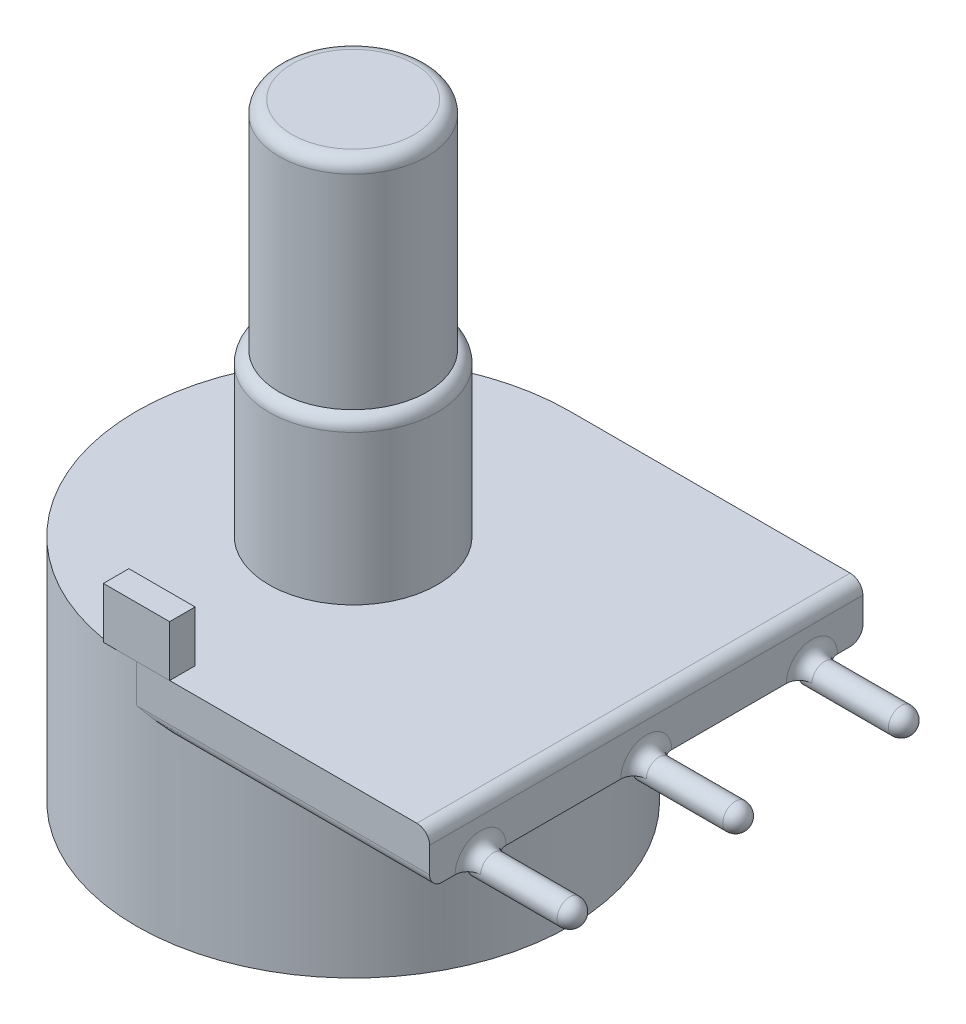
ISO-10303-21;
HEADER;
FILE_DESCRIPTION(('STEP AP214'),'2;1');
FILE_NAME('part.step','',(''),(''),'','','');
FILE_SCHEMA(('AUTOMOTIVE_DESIGN { 1 0 10303 214 1 1 1 1 }'));
ENDSEC;
DATA;
#1=APPLICATION_CONTEXT('core data for automotive mechanical design processes');
#2=APPLICATION_PROTOCOL_DEFINITION('international standard','automotive_design',2000,#1);
#3=PRODUCT_CONTEXT('',#1,'mechanical');
#4=PRODUCT('Part','Part','',(#3));
#5=PRODUCT_RELATED_PRODUCT_CATEGORY('part','',(#4));
#6=PRODUCT_DEFINITION_FORMATION('','',#4);
#7=PRODUCT_DEFINITION_CONTEXT('part definition',#1,'design');
#8=PRODUCT_DEFINITION('design','',#6,#7);
#9=PRODUCT_DEFINITION_SHAPE('','',#8);
#10=(LENGTH_UNIT() NAMED_UNIT(*) SI_UNIT(.MILLI.,.METRE.));
#11=(NAMED_UNIT(*) PLANE_ANGLE_UNIT() SI_UNIT($,.RADIAN.));
#12=(NAMED_UNIT(*) SI_UNIT($,.STERADIAN.) SOLID_ANGLE_UNIT());
#13=UNCERTAINTY_MEASURE_WITH_UNIT(LENGTH_MEASURE(1.E-05),#10,'distance_accuracy_value','');
#14=(GEOMETRIC_REPRESENTATION_CONTEXT(3) GLOBAL_UNCERTAINTY_ASSIGNED_CONTEXT((#13)) GLOBAL_UNIT_ASSIGNED_CONTEXT((#10,
#11,#12)) REPRESENTATION_CONTEXT('',''));
#15=CARTESIAN_POINT('',(0.,0.,0.));
#16=DIRECTION('',(0.,0.,1.));
#17=DIRECTION('',(1.,0.,0.));
#18=AXIS2_PLACEMENT_3D('',#15,#16,#17);
#19=CARTESIAN_POINT('',(-1.3,11.,7.5));
#20=DIRECTION('',(1.,0.,0.));
#21=DIRECTION('',(0.,0.,-1.));
#22=AXIS2_PLACEMENT_3D('',#19,#20,#21);
#23=PLANE('',#22);
#24=DIRECTION('',(0.,0.,1.));
#25=VECTOR('',#24,1.);
#26=CARTESIAN_POINT('',(-1.3,9.,7.5));
#27=LINE('',#26,#25);
#28=CARTESIAN_POINT('',(-1.3,9.,7.5));
#29=VERTEX_POINT('',#28);
#30=CARTESIAN_POINT('',(-1.3,9.,8.5));
#31=VERTEX_POINT('',#30);
#32=EDGE_CURVE('E108',#29,#31,#27,.T.);
#33=ORIENTED_EDGE('',*,*,#32,.T.);
#34=DIRECTION('',(0.,-1.,0.));
#35=VECTOR('',#34,1.);
#36=CARTESIAN_POINT('',(-1.3,11.,8.5));
#37=LINE('',#36,#35);
#38=CARTESIAN_POINT('',(-1.3,11.,8.5));
#39=VERTEX_POINT('',#38);
#40=EDGE_CURVE('E12',#39,#31,#37,.T.);
#41=ORIENTED_EDGE('',*,*,#40,.F.);
#42=DIRECTION('',(0.,0.,1.));
#43=VECTOR('',#42,1.);
#44=CARTESIAN_POINT('',(-1.3,11.,7.5));
#45=LINE('',#44,#43);
#46=CARTESIAN_POINT('',(-1.3,11.,7.5));
#47=VERTEX_POINT('',#46);
#48=EDGE_CURVE('E96',#47,#39,#45,.T.);
#49=ORIENTED_EDGE('',*,*,#48,.F.);
#50=DIRECTION('',(0.,-1.,0.));
#51=VECTOR('',#50,1.);
#52=CARTESIAN_POINT('',(-1.3,11.,7.5));
#53=LINE('',#52,#51);
#54=EDGE_CURVE('E104',#47,#29,#53,.T.);
#55=ORIENTED_EDGE('',*,*,#54,.T.);
#56=EDGE_LOOP('',(#33,#41,#49,#55));
#57=FACE_BOUND('',#56,.T.);
#58=ADVANCED_FACE('F45',(#57),#23,.F.);
#59=CARTESIAN_POINT('',(-1.3,11.,8.5));
#60=DIRECTION('',(0.,0.,-1.));
#61=DIRECTION('',(-1.,0.,0.));
#62=AXIS2_PLACEMENT_3D('',#59,#60,#61);
#63=PLANE('',#62);
#64=DIRECTION('',(1.,0.,0.));
#65=VECTOR('',#64,1.);
#66=CARTESIAN_POINT('',(-1.3,9.,8.5));
#67=LINE('',#66,#65);
#68=CARTESIAN_POINT('',(1.3,9.,8.5));
#69=VERTEX_POINT('',#68);
#70=EDGE_CURVE('E100',#31,#69,#67,.T.);
#71=ORIENTED_EDGE('',*,*,#70,.T.);
#72=DIRECTION('',(0.,-1.,0.));
#73=VECTOR('',#72,1.);
#74=CARTESIAN_POINT('',(1.3,11.,8.5));
#75=LINE('',#74,#73);
#76=CARTESIAN_POINT('',(1.3,11.,8.5));
#77=VERTEX_POINT('',#76);
#78=EDGE_CURVE('E53',#77,#69,#75,.T.);
#79=ORIENTED_EDGE('',*,*,#78,.F.);
#80=DIRECTION('',(1.,0.,0.));
#81=VECTOR('',#80,1.);
#82=CARTESIAN_POINT('',(-1.3,11.,8.5));
#83=LINE('',#82,#81);
#84=EDGE_CURVE('E91',#39,#77,#83,.T.);
#85=ORIENTED_EDGE('',*,*,#84,.F.);
#86=ORIENTED_EDGE('',*,*,#40,.T.);
#87=EDGE_LOOP('',(#71,#79,#85,#86));
#88=FACE_BOUND('',#87,.T.);
#89=ADVANCED_FACE('F99',(#88),#63,.F.);
#90=CARTESIAN_POINT('',(1.3,11.,7.5));
#91=DIRECTION('',(-1.,0.,0.));
#92=DIRECTION('',(0.,0.,1.));
#93=AXIS2_PLACEMENT_3D('',#90,#91,#92);
#94=PLANE('',#93);
#95=DIRECTION('',(0.,0.,-1.));
#96=VECTOR('',#95,1.);
#97=CARTESIAN_POINT('',(1.3,9.,7.5));
#98=LINE('',#97,#96);
#99=CARTESIAN_POINT('',(1.3,9.,7.5));
#100=VERTEX_POINT('',#99);
#101=EDGE_CURVE('E78',#69,#100,#98,.T.);
#102=ORIENTED_EDGE('',*,*,#101,.T.);
#103=DIRECTION('',(0.,-1.,0.));
#104=VECTOR('',#103,1.);
#105=CARTESIAN_POINT('',(1.3,11.,7.5));
#106=LINE('',#105,#104);
#107=CARTESIAN_POINT('',(1.3,11.,7.5));
#108=VERTEX_POINT('',#107);
#109=EDGE_CURVE('E101',#108,#100,#106,.T.);
#110=ORIENTED_EDGE('',*,*,#109,.F.);
#111=DIRECTION('',(0.,0.,-1.));
#112=VECTOR('',#111,1.);
#113=CARTESIAN_POINT('',(1.3,11.,7.5));
#114=LINE('',#113,#112);
#115=EDGE_CURVE('E94',#77,#108,#114,.T.);
#116=ORIENTED_EDGE('',*,*,#115,.F.);
#117=ORIENTED_EDGE('',*,*,#78,.T.);
#118=EDGE_LOOP('',(#102,#110,#116,#117));
#119=FACE_BOUND('',#118,.T.);
#120=ADVANCED_FACE('F102',(#119),#94,.F.);
#121=CARTESIAN_POINT('',(-1.3,11.,7.5));
#122=DIRECTION('',(0.,0.,1.));
#123=DIRECTION('',(1.,0.,0.));
#124=AXIS2_PLACEMENT_3D('',#121,#122,#123);
#125=PLANE('',#124);
#126=DIRECTION('',(-1.,0.,0.));
#127=VECTOR('',#126,1.);
#128=CARTESIAN_POINT('',(-1.3,9.,7.5));
#129=LINE('',#128,#127);
#130=EDGE_CURVE('E84',#100,#29,#129,.T.);
#131=ORIENTED_EDGE('',*,*,#130,.T.);
#132=ORIENTED_EDGE('',*,*,#54,.F.);
#133=DIRECTION('',(-1.,0.,0.));
#134=VECTOR('',#133,1.);
#135=CARTESIAN_POINT('',(-1.3,11.,7.5));
#136=LINE('',#135,#134);
#137=EDGE_CURVE('E61',#108,#47,#136,.T.);
#138=ORIENTED_EDGE('',*,*,#137,.F.);
#139=ORIENTED_EDGE('',*,*,#109,.T.);
#140=EDGE_LOOP('',(#131,#132,#138,#139));
#141=FACE_BOUND('',#140,.T.);
#142=ADVANCED_FACE('F115',(#141),#125,.F.);
#143=CARTESIAN_POINT('',(0.,11.,0.));
#144=DIRECTION('',(0.,1.,0.));
#145=DIRECTION('',(0.,0.,1.));
#146=AXIS2_PLACEMENT_3D('',#143,#144,#145);
#147=PLANE('',#146);
#148=ORIENTED_EDGE('',*,*,#48,.T.);
#149=ORIENTED_EDGE('',*,*,#84,.T.);
#150=ORIENTED_EDGE('',*,*,#115,.T.);
#151=ORIENTED_EDGE('',*,*,#137,.T.);
#152=EDGE_LOOP('',(#148,#149,#150,#151));
#153=FACE_BOUND('',#152,.T.);
#154=ADVANCED_FACE('F92',(#153),#147,.T.);
#155=CARTESIAN_POINT('',(0.,9.,0.));
#156=DIRECTION('',(0.,1.,0.));
#157=DIRECTION('',(0.,0.,1.));
#158=AXIS2_PLACEMENT_3D('',#155,#156,#157);
#159=PLANE('',#158);
#160=ORIENTED_EDGE('',*,*,#32,.F.);
#161=ORIENTED_EDGE('',*,*,#130,.F.);
#162=ORIENTED_EDGE('',*,*,#101,.F.);
#163=ORIENTED_EDGE('',*,*,#70,.F.);
#164=EDGE_LOOP('',(#160,#161,#162,#163));
#165=FACE_BOUND('',#164,.T.);
#166=ADVANCED_FACE('F118',(#165),#159,.F.);
#167=CLOSED_SHELL('',(#58,#89,#120,#142,#154,#166));
#168=MANIFOLD_SOLID_BREP('B2',#167);
#169=CARTESIAN_POINT('',(11.5,7.,-8.5));
#170=DIRECTION('',(1.,0.,0.));
#171=DIRECTION('',(0.,0.,-1.));
#172=AXIS2_PLACEMENT_3D('',#169,#170,#171);
#173=PLANE('',#172);
#174=DIRECTION('',(0.,0.,-1.));
#175=VECTOR('',#174,1.);
#176=CARTESIAN_POINT('',(11.5,7.,-8.5));
#177=LINE('',#176,#175);
#178=CARTESIAN_POINT('',(11.5,7.,8.));
#179=VERTEX_POINT('',#178);
#180=CARTESIAN_POINT('',(11.5,7.,7.5));
#181=VERTEX_POINT('',#180);
#182=EDGE_CURVE('E318',#179,#181,#177,.T.);
#183=ORIENTED_EDGE('',*,*,#182,.T.);
#184=CARTESIAN_POINT('',(11.5,7.,6.5));
#185=DIRECTION('',(1.,0.,0.));
#186=DIRECTION('',(0.,0.,-1.));
#187=AXIS2_PLACEMENT_3D('',#184,#185,#186);
#188=CIRCLE('',#187,1.);
#189=CARTESIAN_POINT('',(11.5,7.,5.5));
#190=VERTEX_POINT('',#189);
#191=EDGE_CURVE('E386',#181,#190,#188,.F.);
#192=ORIENTED_EDGE('',*,*,#191,.T.);
#193=CARTESIAN_POINT('',(11.5,7.,1.));
#194=VERTEX_POINT('',#193);
#195=EDGE_CURVE('E312',#190,#194,#177,.T.);
#196=ORIENTED_EDGE('',*,*,#195,.T.);
#197=CARTESIAN_POINT('',(11.5,7.,0.));
#198=DIRECTION('',(1.,0.,0.));
#199=DIRECTION('',(0.,0.,-1.));
#200=AXIS2_PLACEMENT_3D('',#197,#198,#199);
#201=CIRCLE('',#200,1.);
#202=CARTESIAN_POINT('',(11.5,7.,-1.));
#203=VERTEX_POINT('',#202);
#204=EDGE_CURVE('E384',#194,#203,#201,.F.);
#205=ORIENTED_EDGE('',*,*,#204,.T.);
#206=CARTESIAN_POINT('',(11.5,7.,-5.5));
#207=VERTEX_POINT('',#206);
#208=EDGE_CURVE('E313',#203,#207,#177,.T.);
#209=ORIENTED_EDGE('',*,*,#208,.T.);
#210=CARTESIAN_POINT('',(11.5,7.,-6.5));
#211=DIRECTION('',(1.,0.,0.));
#212=DIRECTION('',(0.,0.,-1.));
#213=AXIS2_PLACEMENT_3D('',#210,#211,#212);
#214=CIRCLE('',#213,1.);
#215=CARTESIAN_POINT('',(11.5,7.,-7.5));
#216=VERTEX_POINT('',#215);
#217=EDGE_CURVE('E382',#207,#216,#214,.F.);
#218=ORIENTED_EDGE('',*,*,#217,.T.);
#219=CARTESIAN_POINT('',(11.5,7.,-8.));
#220=VERTEX_POINT('',#219);
#221=EDGE_CURVE('E320',#216,#220,#177,.T.);
#222=ORIENTED_EDGE('',*,*,#221,.T.);
#223=CARTESIAN_POINT('',(11.5,7.5,-8.));
#224=DIRECTION('',(1.,0.,0.));
#225=DIRECTION('',(0.,0.,-1.));
#226=AXIS2_PLACEMENT_3D('',#223,#224,#225);
#227=CIRCLE('',#226,0.5);
#228=CARTESIAN_POINT('',(11.5,7.5,-8.5));
#229=VERTEX_POINT('',#228);
#230=EDGE_CURVE('E376',#220,#229,#227,.T.);
#231=ORIENTED_EDGE('',*,*,#230,.T.);
#232=DIRECTION('',(0.,1.,0.));
#233=VECTOR('',#232,1.);
#234=CARTESIAN_POINT('',(11.5,7.,-8.5));
#235=LINE('',#234,#233);
#236=CARTESIAN_POINT('',(11.5,8.5,-8.5));
#237=VERTEX_POINT('',#236);
#238=EDGE_CURVE('E345',#229,#237,#235,.T.);
#239=ORIENTED_EDGE('',*,*,#238,.T.);
#240=DIRECTION('',(0.,0.,-1.));
#241=VECTOR('',#240,1.);
#242=CARTESIAN_POINT('',(11.5,8.5,-8.5));
#243=LINE('',#242,#241);
#244=CARTESIAN_POINT('',(11.5,8.5,8.5));
#245=VERTEX_POINT('',#244);
#246=EDGE_CURVE('E380',#237,#245,#243,.F.);
#247=ORIENTED_EDGE('',*,*,#246,.T.);
#248=DIRECTION('',(0.,1.,0.));
#249=VECTOR('',#248,1.);
#250=CARTESIAN_POINT('',(11.5,7.,8.5));
#251=LINE('',#250,#249);
#252=CARTESIAN_POINT('',(11.5,7.5,8.5));
#253=VERTEX_POINT('',#252);
#254=EDGE_CURVE('E338',#253,#245,#251,.T.);
#255=ORIENTED_EDGE('',*,*,#254,.F.);
#256=CARTESIAN_POINT('',(11.5,7.5,8.));
#257=DIRECTION('',(1.,0.,0.));
#258=DIRECTION('',(0.,0.,-1.));
#259=AXIS2_PLACEMENT_3D('',#256,#257,#258);
#260=CIRCLE('',#259,0.5);
#261=EDGE_CURVE('E378',#253,#179,#260,.T.);
#262=ORIENTED_EDGE('',*,*,#261,.T.);
#263=EDGE_LOOP('',(#183,#192,#196,#205,#209,#218,#222,#231,#239,#247,#255,#262));
#264=FACE_BOUND('',#263,.T.);
#265=ADVANCED_FACE('F177',(#264),#173,.T.);
#266=CARTESIAN_POINT('',(0.,9.,0.));
#267=DIRECTION('',(0.,-1.,0.));
#268=DIRECTION('',(0.,0.,-1.));
#269=AXIS2_PLACEMENT_3D('',#266,#267,#268);
#270=CYLINDRICAL_SURFACE('',#269,8.5);
#271=CARTESIAN_POINT('',(0.,9.,0.));
#272=DIRECTION('',(0.,1.,0.));
#273=DIRECTION('',(0.,0.,1.));
#274=AXIS2_PLACEMENT_3D('',#271,#272,#273);
#275=CIRCLE('',#274,8.5);
#276=CARTESIAN_POINT('',(0.,9.,-8.5));
#277=VERTEX_POINT('',#276);
#278=CARTESIAN_POINT('',(0.,9.,8.5));
#279=VERTEX_POINT('',#278);
#280=EDGE_CURVE('E349',#277,#279,#275,.T.);
#281=ORIENTED_EDGE('',*,*,#280,.F.);
#282=DIRECTION('',(0.,1.,0.));
#283=VECTOR('',#282,1.);
#284=CARTESIAN_POINT('',(0.,7.,-8.5));
#285=LINE('',#284,#283);
#286=CARTESIAN_POINT('',(0.,7.5,-8.5));
#287=VERTEX_POINT('',#286);
#288=EDGE_CURVE('E356',#287,#277,#285,.T.);
#289=ORIENTED_EDGE('',*,*,#288,.F.);
#290=CARTESIAN_POINT('',(2.87228132326902,7.,-8.));
#291=CARTESIAN_POINT('',(2.79316459012091,7.00004835846181,-8.0284085308163));
#292=CARTESIAN_POINT('',(2.71366589497789,7.00241658527,-8.0556236929763));
#293=CARTESIAN_POINT('',(2.55414671231525,7.01099612982927,-8.10761083357674));
#294=CARTESIAN_POINT('',(2.47412671773108,7.0172042263118,-8.1323848397296));
#295=CARTESIAN_POINT('',(2.31380175722294,7.03265728218845,-8.17944341224297));
#296=CARTESIAN_POINT('',(2.23349744858098,7.04189738663411,-8.20173188257407));
#297=CARTESIAN_POINT('',(2.07255680069511,7.06287252067626,-8.24387229615714));
#298=CARTESIAN_POINT('',(1.99192036682748,7.07460831762408,-8.26372348705019));
#299=CARTESIAN_POINT('',(1.75444929079184,7.11209771031187,-8.3185195500485));
#300=CARTESIAN_POINT('',(1.59726702641732,7.14065526215726,-8.35010361627794));
#301=CARTESIAN_POINT('',(1.28237413375566,7.20285249873341,-8.40422916082996));
#302=CARTESIAN_POINT('',(1.12466334014558,7.23649395448309,-8.42676747795102));
#303=CARTESIAN_POINT('',(0.65091759761006,7.34216132258188,-8.48099845475784));
#304=CARTESIAN_POINT('',(0.33423743417195,7.41893609499176,-8.49931442398609));
#305=CARTESIAN_POINT('',(0.0119462562253802,7.49710263568902,-8.49999370074764));
#306=CARTESIAN_POINT('',(0.00597305939527205,7.49855134951429,-8.49999999663624));
#307=CARTESIAN_POINT('',(0.,7.5,-8.5));
#308=B_SPLINE_CURVE_WITH_KNOTS('',3,(#290,#291,#292,#293,#294,#295,#296,#297,#298,#299,#300,
#301,#302,#303,#304,#305,#306,#307),.UNSPECIFIED.,.F.,.F.,(4,2,2,2,2,2,2,2,4),(0.,
0.252084789607001,0.503958391444022,0.75543063734787,1.00698031558415,1.49508120561721,
1.98335252316736,2.95979613704815,2.97823523563765),.UNSPECIFIED.);
#309=CARTESIAN_POINT('',(2.87228132326902,7.,-8.));
#310=VERTEX_POINT('',#309);
#311=EDGE_CURVE('E43',#287,#310,#308,.F.);
#312=ORIENTED_EDGE('',*,*,#311,.T.);
#313=CARTESIAN_POINT('',(0.,7.,0.));
#314=DIRECTION('',(0.,1.,0.));
#315=DIRECTION('',(0.,0.,1.));
#316=AXIS2_PLACEMENT_3D('',#313,#314,#315);
#317=CIRCLE('',#316,8.5);
#318=CARTESIAN_POINT('',(2.87228132326902,7.,8.));
#319=VERTEX_POINT('',#318);
#320=EDGE_CURVE('E352',#319,#310,#317,.T.);
#321=ORIENTED_EDGE('',*,*,#320,.F.);
#322=CARTESIAN_POINT('',(2.87228132326902,7.,8.));
#323=CARTESIAN_POINT('',(2.79316459012091,7.00004835846181,8.0284085308163));
#324=CARTESIAN_POINT('',(2.71366589497789,7.00241658527,8.0556236929763));
#325=CARTESIAN_POINT('',(2.55414671231525,7.01099612982927,8.10761083357674));
#326=CARTESIAN_POINT('',(2.47412671773108,7.0172042263118,8.1323848397296));
#327=CARTESIAN_POINT('',(2.31380175722294,7.03265728218845,8.17944341224297));
#328=CARTESIAN_POINT('',(2.23349744858098,7.04189738663411,8.20173188257407));
#329=CARTESIAN_POINT('',(2.07255680069511,7.06287252067626,8.24387229615714));
#330=CARTESIAN_POINT('',(1.99192036682748,7.07460831762408,8.26372348705019));
#331=CARTESIAN_POINT('',(1.75444929079184,7.11209771031187,8.3185195500485));
#332=CARTESIAN_POINT('',(1.59726702641732,7.14065526215726,8.35010361627794));
#333=CARTESIAN_POINT('',(1.28237413375566,7.20285249873341,8.40422916082996));
#334=CARTESIAN_POINT('',(1.12466334014558,7.23649395448309,8.42676747795102));
#335=CARTESIAN_POINT('',(0.65091759761006,7.34216132258188,8.48099845475784));
#336=CARTESIAN_POINT('',(0.33423743417195,7.41893609499176,8.49931442398609));
#337=CARTESIAN_POINT('',(0.0119462562253802,7.49710263568902,8.49999370074764));
#338=CARTESIAN_POINT('',(0.00597305939527205,7.49855134951429,8.49999999663624));
#339=CARTESIAN_POINT('',(0.,7.5,8.5));
#340=B_SPLINE_CURVE_WITH_KNOTS('',3,(#322,#323,#324,#325,#326,#327,#328,#329,#330,#331,#332,
#333,#334,#335,#336,#337,#338,#339),.UNSPECIFIED.,.F.,.F.,(4,2,2,2,2,2,2,2,4),(0.,
0.252084789607001,0.503958391444022,0.75543063734787,1.00698031558415,1.49508120561721,
1.98335252316736,2.95979613704815,2.97823523563765),.UNSPECIFIED.);
#341=CARTESIAN_POINT('',(0.,7.5,8.5));
#342=VERTEX_POINT('',#341);
#343=EDGE_CURVE('E190',#319,#342,#340,.T.);
#344=ORIENTED_EDGE('',*,*,#343,.T.);
#345=DIRECTION('',(0.,1.,0.));
#346=VECTOR('',#345,1.);
#347=CARTESIAN_POINT('',(0.,7.,8.5));
#348=LINE('',#347,#346);
#349=EDGE_CURVE('E336',#342,#279,#348,.T.);
#350=ORIENTED_EDGE('',*,*,#349,.T.);
#351=EDGE_LOOP('',(#281,#289,#312,#321,#344,#350));
#352=FACE_BOUND('',#351,.T.);
#353=CARTESIAN_POINT('',(0.,0.,0.));
#354=DIRECTION('',(0.,1.,0.));
#355=DIRECTION('',(0.,0.,1.));
#356=AXIS2_PLACEMENT_3D('',#353,#354,#355);
#357=CIRCLE('',#356,8.5);
#358=CARTESIAN_POINT('',(0.,0.,8.5));
#359=VERTEX_POINT('',#358);
#360=EDGE_CURVE('E353',#359,#359,#357,.T.);
#361=ORIENTED_EDGE('',*,*,#360,.T.);
#362=EDGE_LOOP('',(#361));
#363=FACE_BOUND('',#362,.T.);
#364=ADVANCED_FACE('F441',(#352,#363),#270,.T.);
#365=CARTESIAN_POINT('',(0.,9.,0.));
#366=DIRECTION('',(0.,1.,0.));
#367=DIRECTION('',(0.,0.,1.));
#368=AXIS2_PLACEMENT_3D('',#365,#366,#367);
#369=PLANE('',#368);
#370=CARTESIAN_POINT('',(0.,9.,0.));
#371=DIRECTION('',(0.,1.,0.));
#372=DIRECTION('',(0.,0.,1.));
#373=AXIS2_PLACEMENT_3D('',#370,#371,#372);
#374=CIRCLE('',#373,3.3);
#375=CARTESIAN_POINT('',(0.,9.,3.3));
#376=VERTEX_POINT('',#375);
#377=EDGE_CURVE('E359',#376,#376,#374,.T.);
#378=ORIENTED_EDGE('',*,*,#377,.F.);
#379=EDGE_LOOP('',(#378));
#380=FACE_BOUND('',#379,.T.);
#381=DIRECTION('',(1.,0.,0.));
#382=VECTOR('',#381,1.);
#383=CARTESIAN_POINT('',(11.5,9.,8.5));
#384=LINE('',#383,#382);
#385=CARTESIAN_POINT('',(11.,9.,8.5));
#386=VERTEX_POINT('',#385);
#387=EDGE_CURVE('E333',#279,#386,#384,.T.);
#388=ORIENTED_EDGE('',*,*,#387,.T.);
#389=DIRECTION('',(0.,0.,-1.));
#390=VECTOR('',#389,1.);
#391=CARTESIAN_POINT('',(11.,9.,0.));
#392=LINE('',#391,#390);
#393=CARTESIAN_POINT('',(11.,9.,-8.5));
#394=VERTEX_POINT('',#393);
#395=EDGE_CURVE('E401',#386,#394,#392,.T.);
#396=ORIENTED_EDGE('',*,*,#395,.T.);
#397=DIRECTION('',(-1.,0.,0.));
#398=VECTOR('',#397,1.);
#399=CARTESIAN_POINT('',(0.,9.,-8.5));
#400=LINE('',#399,#398);
#401=EDGE_CURVE('E328',#394,#277,#400,.T.);
#402=ORIENTED_EDGE('',*,*,#401,.T.);
#403=ORIENTED_EDGE('',*,*,#280,.T.);
#404=EDGE_LOOP('',(#388,#396,#402,#403));
#405=FACE_BOUND('',#404,.T.);
#406=ADVANCED_FACE('F497',(#380,#405),#369,.T.);
#407=CARTESIAN_POINT('',(0.,0.,0.));
#408=DIRECTION('',(0.,1.,0.));
#409=DIRECTION('',(0.,0.,1.));
#410=AXIS2_PLACEMENT_3D('',#407,#408,#409);
#411=PLANE('',#410);
#412=ORIENTED_EDGE('',*,*,#360,.F.);
#413=EDGE_LOOP('',(#412));
#414=FACE_BOUND('',#413,.T.);
#415=ADVANCED_FACE('F508',(#414),#411,.F.);
#416=CARTESIAN_POINT('',(0.,7.,0.));
#417=DIRECTION('',(0.,1.,0.));
#418=DIRECTION('',(0.,0.,1.));
#419=AXIS2_PLACEMENT_3D('',#416,#417,#418);
#420=PLANE('',#419);
#421=ORIENTED_EDGE('',*,*,#182,.F.);
#422=DIRECTION('',(1.,0.,0.));
#423=VECTOR('',#422,1.);
#424=CARTESIAN_POINT('',(0.,7.,8.));
#425=LINE('',#424,#423);
#426=EDGE_CURVE('E425',#179,#319,#425,.F.);
#427=ORIENTED_EDGE('',*,*,#426,.T.);
#428=ORIENTED_EDGE('',*,*,#320,.T.);
#429=DIRECTION('',(-1.,0.,0.));
#430=VECTOR('',#429,1.);
#431=CARTESIAN_POINT('',(11.5,7.,-8.));
#432=LINE('',#431,#430);
#433=EDGE_CURVE('E423',#310,#220,#432,.F.);
#434=ORIENTED_EDGE('',*,*,#433,.T.);
#435=ORIENTED_EDGE('',*,*,#221,.F.);
#436=CARTESIAN_POINT('',(12.,7.,-7.5));
#437=DIRECTION('',(0.,1.,0.));
#438=DIRECTION('',(0.,0.,1.));
#439=AXIS2_PLACEMENT_3D('',#436,#437,#438);
#440=CIRCLE('',#439,0.5);
#441=CARTESIAN_POINT('',(12.,7.,-7.));
#442=VERTEX_POINT('',#441);
#443=EDGE_CURVE('E437',#216,#442,#440,.T.);
#444=ORIENTED_EDGE('',*,*,#443,.T.);
#445=DIRECTION('',(-1.,0.,0.));
#446=VECTOR('',#445,1.);
#447=CARTESIAN_POINT('',(11.5,7.,-7.));
#448=LINE('',#447,#446);
#449=CARTESIAN_POINT('',(11.5,7.,-7.));
#450=VERTEX_POINT('',#449);
#451=EDGE_CURVE('E197',#450,#442,#448,.F.);
#452=ORIENTED_EDGE('',*,*,#451,.F.);
#453=CARTESIAN_POINT('',(11.5,7.,-6.));
#454=VERTEX_POINT('',#453);
#455=EDGE_CURVE('E316',#454,#450,#177,.T.);
#456=ORIENTED_EDGE('',*,*,#455,.F.);
#457=DIRECTION('',(-1.,0.,0.));
#458=VECTOR('',#457,1.);
#459=CARTESIAN_POINT('',(12.,7.,-6.));
#460=LINE('',#459,#458);
#461=CARTESIAN_POINT('',(12.,7.,-6.));
#462=VERTEX_POINT('',#461);
#463=EDGE_CURVE('E399',#462,#454,#460,.T.);
#464=ORIENTED_EDGE('',*,*,#463,.F.);
#465=CARTESIAN_POINT('',(12.,7.,-5.5));
#466=DIRECTION('',(0.,1.,0.));
#467=DIRECTION('',(0.,0.,1.));
#468=AXIS2_PLACEMENT_3D('',#465,#466,#467);
#469=CIRCLE('',#468,0.5);
#470=EDGE_CURVE('E435',#462,#207,#469,.T.);
#471=ORIENTED_EDGE('',*,*,#470,.T.);
#472=ORIENTED_EDGE('',*,*,#208,.F.);
#473=CARTESIAN_POINT('',(12.,7.,-1.));
#474=DIRECTION('',(0.,1.,0.));
#475=DIRECTION('',(0.,0.,1.));
#476=AXIS2_PLACEMENT_3D('',#473,#474,#475);
#477=CIRCLE('',#476,0.5);
#478=CARTESIAN_POINT('',(12.,7.,-0.5));
#479=VERTEX_POINT('',#478);
#480=EDGE_CURVE('E433',#203,#479,#477,.T.);
#481=ORIENTED_EDGE('',*,*,#480,.T.);
#482=DIRECTION('',(-1.,0.,0.));
#483=VECTOR('',#482,1.);
#484=CARTESIAN_POINT('',(11.5,7.,-0.5));
#485=LINE('',#484,#483);
#486=CARTESIAN_POINT('',(11.5,7.,-0.5));
#487=VERTEX_POINT('',#486);
#488=EDGE_CURVE('E204',#487,#479,#485,.F.);
#489=ORIENTED_EDGE('',*,*,#488,.F.);
#490=CARTESIAN_POINT('',(11.5,7.,0.5));
#491=VERTEX_POINT('',#490);
#492=EDGE_CURVE('E306',#491,#487,#177,.T.);
#493=ORIENTED_EDGE('',*,*,#492,.F.);
#494=DIRECTION('',(-1.,0.,0.));
#495=VECTOR('',#494,1.);
#496=CARTESIAN_POINT('',(12.,7.,0.5));
#497=LINE('',#496,#495);
#498=CARTESIAN_POINT('',(12.,7.,0.5));
#499=VERTEX_POINT('',#498);
#500=EDGE_CURVE('E295',#499,#491,#497,.T.);
#501=ORIENTED_EDGE('',*,*,#500,.F.);
#502=CARTESIAN_POINT('',(12.,7.,1.));
#503=DIRECTION('',(0.,1.,0.));
#504=DIRECTION('',(0.,0.,1.));
#505=AXIS2_PLACEMENT_3D('',#502,#503,#504);
#506=CIRCLE('',#505,0.5);
#507=EDGE_CURVE('E431',#499,#194,#506,.T.);
#508=ORIENTED_EDGE('',*,*,#507,.T.);
#509=ORIENTED_EDGE('',*,*,#195,.F.);
#510=CARTESIAN_POINT('',(12.,7.,5.5));
#511=DIRECTION('',(0.,1.,0.));
#512=DIRECTION('',(0.,0.,1.));
#513=AXIS2_PLACEMENT_3D('',#510,#511,#512);
#514=CIRCLE('',#513,0.5);
#515=CARTESIAN_POINT('',(12.,7.,6.));
#516=VERTEX_POINT('',#515);
#517=EDGE_CURVE('E429',#190,#516,#514,.T.);
#518=ORIENTED_EDGE('',*,*,#517,.T.);
#519=DIRECTION('',(-1.,0.,0.));
#520=VECTOR('',#519,1.);
#521=CARTESIAN_POINT('',(11.5,7.,6.));
#522=LINE('',#521,#520);
#523=CARTESIAN_POINT('',(11.5,7.,6.));
#524=VERTEX_POINT('',#523);
#525=EDGE_CURVE('E368',#524,#516,#522,.F.);
#526=ORIENTED_EDGE('',*,*,#525,.F.);
#527=CARTESIAN_POINT('',(11.5,7.,7.));
#528=VERTEX_POINT('',#527);
#529=EDGE_CURVE('E315',#528,#524,#177,.T.);
#530=ORIENTED_EDGE('',*,*,#529,.F.);
#531=DIRECTION('',(-1.,0.,0.));
#532=VECTOR('',#531,1.);
#533=CARTESIAN_POINT('',(12.,7.,7.));
#534=LINE('',#533,#532);
#535=CARTESIAN_POINT('',(12.,7.,7.));
#536=VERTEX_POINT('',#535);
#537=EDGE_CURVE('E374',#536,#528,#534,.T.);
#538=ORIENTED_EDGE('',*,*,#537,.F.);
#539=CARTESIAN_POINT('',(12.,7.,7.5));
#540=DIRECTION('',(0.,1.,0.));
#541=DIRECTION('',(0.,0.,1.));
#542=AXIS2_PLACEMENT_3D('',#539,#540,#541);
#543=CIRCLE('',#542,0.5);
#544=EDGE_CURVE('E427',#536,#181,#543,.T.);
#545=ORIENTED_EDGE('',*,*,#544,.T.);
#546=EDGE_LOOP('',(#421,#427,#428,#434,#435,#444,#452,#456,#464,#471,#472,#481,#489,#493,#501,
#508,#509,#518,#526,#530,#538,#545));
#547=FACE_BOUND('',#546,.T.);
#548=ADVANCED_FACE('F311',(#547),#420,.F.);
#549=CARTESIAN_POINT('',(0.,7.,-8.5));
#550=DIRECTION('',(0.,0.,-1.));
#551=DIRECTION('',(-1.,0.,0.));
#552=AXIS2_PLACEMENT_3D('',#549,#550,#551);
#553=PLANE('',#552);
#554=ORIENTED_EDGE('',*,*,#401,.F.);
#555=CARTESIAN_POINT('',(11.,8.5,-8.5));
#556=DIRECTION('',(0.,0.,-1.));
#557=DIRECTION('',(-1.,0.,0.));
#558=AXIS2_PLACEMENT_3D('',#555,#556,#557);
#559=CIRCLE('',#558,0.5);
#560=EDGE_CURVE('E407',#394,#237,#559,.T.);
#561=ORIENTED_EDGE('',*,*,#560,.T.);
#562=ORIENTED_EDGE('',*,*,#238,.F.);
#563=DIRECTION('',(-1.,0.,0.));
#564=VECTOR('',#563,1.);
#565=CARTESIAN_POINT('',(0.,7.5,-8.5));
#566=LINE('',#565,#564);
#567=EDGE_CURVE('E404',#229,#287,#566,.T.);
#568=ORIENTED_EDGE('',*,*,#567,.T.);
#569=ORIENTED_EDGE('',*,*,#288,.T.);
#570=EDGE_LOOP('',(#554,#561,#562,#568,#569));
#571=FACE_BOUND('',#570,.T.);
#572=ADVANCED_FACE('F500',(#571),#553,.T.);
#573=CARTESIAN_POINT('',(11.5,7.,8.5));
#574=DIRECTION('',(0.,0.,1.));
#575=DIRECTION('',(1.,0.,0.));
#576=AXIS2_PLACEMENT_3D('',#573,#574,#575);
#577=PLANE('',#576);
#578=ORIENTED_EDGE('',*,*,#254,.T.);
#579=CARTESIAN_POINT('',(11.,8.5,8.5));
#580=DIRECTION('',(0.,0.,1.));
#581=DIRECTION('',(1.,0.,0.));
#582=AXIS2_PLACEMENT_3D('',#579,#580,#581);
#583=CIRCLE('',#582,0.5);
#584=EDGE_CURVE('E412',#245,#386,#583,.T.);
#585=ORIENTED_EDGE('',*,*,#584,.T.);
#586=ORIENTED_EDGE('',*,*,#387,.F.);
#587=ORIENTED_EDGE('',*,*,#349,.F.);
#588=DIRECTION('',(1.,0.,0.));
#589=VECTOR('',#588,1.);
#590=CARTESIAN_POINT('',(11.5,7.5,8.5));
#591=LINE('',#590,#589);
#592=EDGE_CURVE('E409',#342,#253,#591,.T.);
#593=ORIENTED_EDGE('',*,*,#592,.T.);
#594=EDGE_LOOP('',(#578,#585,#586,#587,#593));
#595=FACE_BOUND('',#594,.T.);
#596=ADVANCED_FACE('F502',(#595),#577,.T.);
#597=CARTESIAN_POINT('',(0.,15.35,0.));
#598=DIRECTION('',(0.,-1.,0.));
#599=DIRECTION('',(0.,0.,-1.));
#600=AXIS2_PLACEMENT_3D('',#597,#598,#599);
#601=CYLINDRICAL_SURFACE('',#600,3.3);
#602=CARTESIAN_POINT('',(0.,14.8601020514434,0.));
#603=DIRECTION('',(0.,1.,0.));
#604=DIRECTION('',(0.,0.,1.));
#605=AXIS2_PLACEMENT_3D('',#602,#603,#604);
#606=CIRCLE('',#605,3.3);
#607=CARTESIAN_POINT('',(0.,14.8601020514434,3.3));
#608=VERTEX_POINT('',#607);
#609=EDGE_CURVE('E420',#608,#608,#606,.F.);
#610=ORIENTED_EDGE('',*,*,#609,.T.);
#611=EDGE_LOOP('',(#610));
#612=FACE_BOUND('',#611,.T.);
#613=ORIENTED_EDGE('',*,*,#377,.T.);
#614=EDGE_LOOP('',(#613));
#615=FACE_BOUND('',#614,.T.);
#616=ADVANCED_FACE('F505',(#612,#615),#601,.T.);
#617=CARTESIAN_POINT('',(0.,23.85,0.));
#618=DIRECTION('',(0.,-1.,0.));
#619=DIRECTION('',(0.,0.,-1.));
#620=AXIS2_PLACEMENT_3D('',#617,#618,#619);
#621=CYLINDRICAL_SURFACE('',#620,2.9);
#622=CARTESIAN_POINT('',(0.,23.35,0.));
#623=DIRECTION('',(0.,1.,0.));
#624=DIRECTION('',(0.,0.,1.));
#625=AXIS2_PLACEMENT_3D('',#622,#623,#624);
#626=CIRCLE('',#625,2.9);
#627=CARTESIAN_POINT('',(0.,23.35,2.9));
#628=VERTEX_POINT('',#627);
#629=EDGE_CURVE('E417',#628,#628,#626,.F.);
#630=ORIENTED_EDGE('',*,*,#629,.T.);
#631=EDGE_LOOP('',(#630));
#632=FACE_BOUND('',#631,.T.);
#633=CARTESIAN_POINT('',(0.,15.35,0.));
#634=DIRECTION('',(0.,-1.,0.));
#635=DIRECTION('',(0.,0.,-1.));
#636=AXIS2_PLACEMENT_3D('',#633,#634,#635);
#637=CIRCLE('',#636,2.9);
#638=CARTESIAN_POINT('',(0.,15.35,-2.9));
#639=VERTEX_POINT('',#638);
#640=EDGE_CURVE('E362',#639,#639,#637,.F.);
#641=ORIENTED_EDGE('',*,*,#640,.T.);
#642=EDGE_LOOP('',(#641));
#643=FACE_BOUND('',#642,.T.);
#644=ADVANCED_FACE('F524',(#632,#643),#621,.T.);
#645=CARTESIAN_POINT('',(0.,23.85,0.));
#646=DIRECTION('',(0.,1.,0.));
#647=DIRECTION('',(0.,0.,1.));
#648=AXIS2_PLACEMENT_3D('',#645,#646,#647);
#649=PLANE('',#648);
#650=CARTESIAN_POINT('',(0.,23.85,0.));
#651=DIRECTION('',(0.,1.,0.));
#652=DIRECTION('',(0.,0.,1.));
#653=AXIS2_PLACEMENT_3D('',#650,#651,#652);
#654=CIRCLE('',#653,2.4);
#655=CARTESIAN_POINT('',(0.,23.85,2.4));
#656=VERTEX_POINT('',#655);
#657=EDGE_CURVE('E414',#656,#656,#654,.T.);
#658=ORIENTED_EDGE('',*,*,#657,.T.);
#659=EDGE_LOOP('',(#658));
#660=FACE_BOUND('',#659,.T.);
#661=ADVANCED_FACE('F528',(#660),#649,.T.);
#662=CARTESIAN_POINT('',(11.5,7.,6.5));
#663=DIRECTION('',(1.,0.,0.));
#664=DIRECTION('',(0.,0.,-1.));
#665=AXIS2_PLACEMENT_3D('',#662,#663,#664);
#666=PLANE('',#665);
#667=CARTESIAN_POINT('',(11.5,7.,6.5));
#668=DIRECTION('',(1.,0.,0.));
#669=DIRECTION('',(0.,0.,-1.));
#670=AXIS2_PLACEMENT_3D('',#667,#668,#669);
#671=CIRCLE('',#670,0.5);
#672=EDGE_CURVE('E307',#528,#524,#671,.T.);
#673=ORIENTED_EDGE('',*,*,#672,.F.);
#674=ORIENTED_EDGE('',*,*,#529,.T.);
#675=EDGE_LOOP('',(#673,#674));
#676=FACE_BOUND('',#675,.T.);
#677=ADVANCED_FACE('F532',(#676),#666,.F.);
#678=CARTESIAN_POINT('',(15.5,7.,6.5));
#679=DIRECTION('',(-1.,0.,0.));
#680=DIRECTION('',(0.,0.,1.));
#681=AXIS2_PLACEMENT_3D('',#678,#679,#680);
#682=CYLINDRICAL_SURFACE('',#681,0.5);
#683=CARTESIAN_POINT('',(15.,7.,6.5));
#684=DIRECTION('',(-1.,0.,0.));
#685=DIRECTION('',(0.,0.,1.));
#686=AXIS2_PLACEMENT_3D('',#683,#684,#685);
#687=CIRCLE('',#686,0.5);
#688=CARTESIAN_POINT('',(15.,7.,7.));
#689=VERTEX_POINT('',#688);
#690=EDGE_CURVE('E365',#689,#689,#687,.T.);
#691=ORIENTED_EDGE('',*,*,#690,.T.);
#692=EDGE_LOOP('',(#691));
#693=FACE_BOUND('',#692,.T.);
#694=CARTESIAN_POINT('',(12.,7.,6.5));
#695=DIRECTION('',(1.,0.,0.));
#696=DIRECTION('',(0.,0.,-1.));
#697=AXIS2_PLACEMENT_3D('',#694,#695,#696);
#698=CIRCLE('',#697,0.5);
#699=EDGE_CURVE('E371',#516,#536,#698,.T.);
#700=ORIENTED_EDGE('',*,*,#699,.T.);
#701=ORIENTED_EDGE('',*,*,#537,.T.);
#702=ORIENTED_EDGE('',*,*,#672,.T.);
#703=ORIENTED_EDGE('',*,*,#525,.T.);
#704=EDGE_LOOP('',(#700,#701,#702,#703));
#705=FACE_BOUND('',#704,.T.);
#706=ADVANCED_FACE('F534',(#693,#705),#682,.T.);
#707=CARTESIAN_POINT('',(11.5,7.,0.));
#708=DIRECTION('',(1.,0.,0.));
#709=DIRECTION('',(0.,0.,-1.));
#710=AXIS2_PLACEMENT_3D('',#707,#708,#709);
#711=PLANE('',#710);
#712=CARTESIAN_POINT('',(11.5,7.,0.));
#713=DIRECTION('',(1.,0.,0.));
#714=DIRECTION('',(0.,0.,-1.));
#715=AXIS2_PLACEMENT_3D('',#712,#713,#714);
#716=CIRCLE('',#715,0.5);
#717=EDGE_CURVE('E298',#491,#487,#716,.T.);
#718=ORIENTED_EDGE('',*,*,#717,.F.);
#719=ORIENTED_EDGE('',*,*,#492,.T.);
#720=EDGE_LOOP('',(#718,#719));
#721=FACE_BOUND('',#720,.T.);
#722=ADVANCED_FACE('F305',(#721),#711,.F.);
#723=CARTESIAN_POINT('',(15.5,7.,0.));
#724=DIRECTION('',(-1.,0.,0.));
#725=DIRECTION('',(0.,0.,1.));
#726=AXIS2_PLACEMENT_3D('',#723,#724,#725);
#727=CYLINDRICAL_SURFACE('',#726,0.5);
#728=CARTESIAN_POINT('',(15.,7.,0.));
#729=DIRECTION('',(-1.,0.,0.));
#730=DIRECTION('',(0.,0.,1.));
#731=AXIS2_PLACEMENT_3D('',#728,#729,#730);
#732=CIRCLE('',#731,0.5);
#733=CARTESIAN_POINT('',(15.,7.,0.5));
#734=VERTEX_POINT('',#733);
#735=EDGE_CURVE('E388',#734,#734,#732,.T.);
#736=ORIENTED_EDGE('',*,*,#735,.T.);
#737=EDGE_LOOP('',(#736));
#738=FACE_BOUND('',#737,.T.);
#739=CARTESIAN_POINT('',(12.,7.,0.));
#740=DIRECTION('',(1.,0.,0.));
#741=DIRECTION('',(0.,0.,-1.));
#742=AXIS2_PLACEMENT_3D('',#739,#740,#741);
#743=CIRCLE('',#742,0.5);
#744=EDGE_CURVE('E301',#479,#499,#743,.T.);
#745=ORIENTED_EDGE('',*,*,#744,.T.);
#746=ORIENTED_EDGE('',*,*,#500,.T.);
#747=ORIENTED_EDGE('',*,*,#717,.T.);
#748=ORIENTED_EDGE('',*,*,#488,.T.);
#749=EDGE_LOOP('',(#745,#746,#747,#748));
#750=FACE_BOUND('',#749,.T.);
#751=ADVANCED_FACE('F297',(#738,#750),#727,.T.);
#752=CARTESIAN_POINT('',(11.5,7.,-6.5));
#753=DIRECTION('',(-1.,0.,0.));
#754=DIRECTION('',(0.,0.,1.));
#755=AXIS2_PLACEMENT_3D('',#752,#753,#754);
#756=PLANE('',#755);
#757=ORIENTED_EDGE('',*,*,#455,.T.);
#758=CARTESIAN_POINT('',(11.5,7.,-6.5));
#759=DIRECTION('',(1.,0.,0.));
#760=DIRECTION('',(0.,0.,1.));
#761=AXIS2_PLACEMENT_3D('',#758,#759,#760);
#762=CIRCLE('',#761,0.5);
#763=EDGE_CURVE('E308',#454,#450,#762,.T.);
#764=ORIENTED_EDGE('',*,*,#763,.F.);
#765=EDGE_LOOP('',(#757,#764));
#766=FACE_BOUND('',#765,.T.);
#767=ADVANCED_FACE('F488',(#766),#756,.T.);
#768=CARTESIAN_POINT('',(15.5,7.,-6.5));
#769=DIRECTION('',(-1.,0.,0.));
#770=DIRECTION('',(0.,0.,1.));
#771=AXIS2_PLACEMENT_3D('',#768,#769,#770);
#772=CYLINDRICAL_SURFACE('',#771,0.5);
#773=CARTESIAN_POINT('',(15.,7.,-6.5));
#774=DIRECTION('',(-1.,0.,0.));
#775=DIRECTION('',(0.,0.,1.));
#776=AXIS2_PLACEMENT_3D('',#773,#774,#775);
#777=CIRCLE('',#776,0.5);
#778=CARTESIAN_POINT('',(15.,7.,-6.));
#779=VERTEX_POINT('',#778);
#780=EDGE_CURVE('E302',#779,#779,#777,.T.);
#781=ORIENTED_EDGE('',*,*,#780,.T.);
#782=EDGE_LOOP('',(#781));
#783=FACE_BOUND('',#782,.T.);
#784=CARTESIAN_POINT('',(12.,7.,-6.5));
#785=DIRECTION('',(1.,0.,0.));
#786=DIRECTION('',(0.,0.,-1.));
#787=AXIS2_PLACEMENT_3D('',#784,#785,#786);
#788=CIRCLE('',#787,0.5);
#789=EDGE_CURVE('E396',#442,#462,#788,.T.);
#790=ORIENTED_EDGE('',*,*,#789,.T.);
#791=ORIENTED_EDGE('',*,*,#463,.T.);
#792=ORIENTED_EDGE('',*,*,#763,.T.);
#793=ORIENTED_EDGE('',*,*,#451,.T.);
#794=EDGE_LOOP('',(#790,#791,#792,#793));
#795=FACE_BOUND('',#794,.T.);
#796=ADVANCED_FACE('F483',(#783,#795),#772,.T.);
#797=CARTESIAN_POINT('',(12.,7.,6.5));
#798=DIRECTION('',(1.,0.,0.));
#799=DIRECTION('',(0.,0.,-1.));
#800=AXIS2_PLACEMENT_3D('',#797,#798,#799);
#801=TOROIDAL_SURFACE('',#800,1.,0.5);
#802=ORIENTED_EDGE('',*,*,#517,.F.);
#803=ORIENTED_EDGE('',*,*,#191,.F.);
#804=ORIENTED_EDGE('',*,*,#544,.F.);
#805=ORIENTED_EDGE('',*,*,#699,.F.);
#806=EDGE_LOOP('',(#802,#803,#804,#805));
#807=FACE_BOUND('',#806,.T.);
#808=ADVANCED_FACE('F480',(#807),#801,.F.);
#809=CARTESIAN_POINT('',(15.,7.,6.5));
#810=DIRECTION('',(0.,0.,1.));
#811=DIRECTION('',(1.,0.,0.));
#812=AXIS2_PLACEMENT_3D('',#809,#810,#811);
#813=SPHERICAL_SURFACE('',#812,0.5);
#814=CARTESIAN_POINT('',(15.,7.,6.5));
#815=DIRECTION('',(-1.,0.,0.));
#816=DIRECTION('',(0.,0.,1.));
#817=AXIS2_PLACEMENT_3D('',#814,#815,#816);
#818=SPHERICAL_SURFACE('',#817,0.5);
#819=ORIENTED_EDGE('',*,*,#690,.F.);
#820=EDGE_LOOP('',(#819));
#821=FACE_BOUND('',#820,.T.);
#822=ADVANCED_FACE('F477',(#821),#818,.T.);
#823=CARTESIAN_POINT('',(12.,7.,0.));
#824=DIRECTION('',(1.,0.,0.));
#825=DIRECTION('',(0.,0.,-1.));
#826=AXIS2_PLACEMENT_3D('',#823,#824,#825);
#827=TOROIDAL_SURFACE('',#826,1.,0.5);
#828=ORIENTED_EDGE('',*,*,#480,.F.);
#829=ORIENTED_EDGE('',*,*,#204,.F.);
#830=ORIENTED_EDGE('',*,*,#507,.F.);
#831=ORIENTED_EDGE('',*,*,#744,.F.);
#832=EDGE_LOOP('',(#828,#829,#830,#831));
#833=FACE_BOUND('',#832,.T.);
#834=ADVANCED_FACE('F473',(#833),#827,.F.);
#835=CARTESIAN_POINT('',(15.,7.,0.));
#836=DIRECTION('',(0.,0.,1.));
#837=DIRECTION('',(1.,0.,0.));
#838=AXIS2_PLACEMENT_3D('',#835,#836,#837);
#839=SPHERICAL_SURFACE('',#838,0.5);
#840=CARTESIAN_POINT('',(15.,7.,0.));
#841=DIRECTION('',(-1.,0.,0.));
#842=DIRECTION('',(0.,0.,1.));
#843=AXIS2_PLACEMENT_3D('',#840,#841,#842);
#844=SPHERICAL_SURFACE('',#843,0.5);
#845=ORIENTED_EDGE('',*,*,#735,.F.);
#846=EDGE_LOOP('',(#845));
#847=FACE_BOUND('',#846,.T.);
#848=ADVANCED_FACE('F469',(#847),#844,.T.);
#849=CARTESIAN_POINT('',(12.,7.,-6.5));
#850=DIRECTION('',(1.,0.,0.));
#851=DIRECTION('',(0.,0.,-1.));
#852=AXIS2_PLACEMENT_3D('',#849,#850,#851);
#853=TOROIDAL_SURFACE('',#852,1.,0.5);
#854=ORIENTED_EDGE('',*,*,#443,.F.);
#855=ORIENTED_EDGE('',*,*,#217,.F.);
#856=ORIENTED_EDGE('',*,*,#470,.F.);
#857=ORIENTED_EDGE('',*,*,#789,.F.);
#858=EDGE_LOOP('',(#854,#855,#856,#857));
#859=FACE_BOUND('',#858,.T.);
#860=ADVANCED_FACE('F465',(#859),#853,.F.);
#861=CARTESIAN_POINT('',(15.,7.,-6.5));
#862=DIRECTION('',(0.,0.,1.));
#863=DIRECTION('',(1.,0.,0.));
#864=AXIS2_PLACEMENT_3D('',#861,#862,#863);
#865=SPHERICAL_SURFACE('',#864,0.5);
#866=CARTESIAN_POINT('',(15.,7.,-6.5));
#867=DIRECTION('',(-1.,0.,0.));
#868=DIRECTION('',(0.,0.,1.));
#869=AXIS2_PLACEMENT_3D('',#866,#867,#868);
#870=SPHERICAL_SURFACE('',#869,0.5);
#871=ORIENTED_EDGE('',*,*,#780,.F.);
#872=EDGE_LOOP('',(#871));
#873=FACE_BOUND('',#872,.T.);
#874=ADVANCED_FACE('F461',(#873),#870,.T.);
#875=CARTESIAN_POINT('',(11.,8.5,0.));
#876=DIRECTION('',(0.,0.,-1.));
#877=DIRECTION('',(-1.,0.,0.));
#878=AXIS2_PLACEMENT_3D('',#875,#876,#877);
#879=CYLINDRICAL_SURFACE('',#878,0.5);
#880=ORIENTED_EDGE('',*,*,#584,.F.);
#881=ORIENTED_EDGE('',*,*,#246,.F.);
#882=ORIENTED_EDGE('',*,*,#560,.F.);
#883=ORIENTED_EDGE('',*,*,#395,.F.);
#884=EDGE_LOOP('',(#880,#881,#882,#883));
#885=FACE_BOUND('',#884,.T.);
#886=ADVANCED_FACE('F457',(#885),#879,.T.);
#887=CARTESIAN_POINT('',(0.,23.35,0.));
#888=DIRECTION('',(0.,1.,0.));
#889=DIRECTION('',(0.,0.,1.));
#890=AXIS2_PLACEMENT_3D('',#887,#888,#889);
#891=TOROIDAL_SURFACE('',#890,2.4,0.5);
#892=ORIENTED_EDGE('',*,*,#629,.F.);
#893=EDGE_LOOP('',(#892));
#894=FACE_BOUND('',#893,.T.);
#895=ORIENTED_EDGE('',*,*,#657,.F.);
#896=EDGE_LOOP('',(#895));
#897=FACE_BOUND('',#896,.T.);
#898=ADVANCED_FACE('F453',(#894,#897),#891,.T.);
#899=CARTESIAN_POINT('',(0.,14.8601020514434,0.));
#900=DIRECTION('',(0.,1.,0.));
#901=DIRECTION('',(0.,0.,1.));
#902=AXIS2_PLACEMENT_3D('',#899,#900,#901);
#903=TOROIDAL_SURFACE('',#902,2.8,0.5);
#904=ORIENTED_EDGE('',*,*,#640,.F.);
#905=EDGE_LOOP('',(#904));
#906=FACE_BOUND('',#905,.T.);
#907=ORIENTED_EDGE('',*,*,#609,.F.);
#908=EDGE_LOOP('',(#907));
#909=FACE_BOUND('',#908,.T.);
#910=ADVANCED_FACE('F449',(#906,#909),#903,.T.);
#911=CARTESIAN_POINT('',(11.5,7.5,8.));
#912=DIRECTION('',(-1.,0.,0.));
#913=DIRECTION('',(0.,0.,1.));
#914=AXIS2_PLACEMENT_3D('',#911,#912,#913);
#915=CYLINDRICAL_SURFACE('',#914,0.5);
#916=ORIENTED_EDGE('',*,*,#343,.F.);
#917=ORIENTED_EDGE('',*,*,#426,.F.);
#918=ORIENTED_EDGE('',*,*,#261,.F.);
#919=ORIENTED_EDGE('',*,*,#592,.F.);
#920=EDGE_LOOP('',(#916,#917,#918,#919));
#921=FACE_BOUND('',#920,.T.);
#922=ADVANCED_FACE('F445',(#921),#915,.T.);
#923=CARTESIAN_POINT('',(0.,7.5,-8.));
#924=DIRECTION('',(1.,0.,0.));
#925=DIRECTION('',(0.,0.,-1.));
#926=AXIS2_PLACEMENT_3D('',#923,#924,#925);
#927=CYLINDRICAL_SURFACE('',#926,0.5);
#928=ORIENTED_EDGE('',*,*,#230,.F.);
#929=ORIENTED_EDGE('',*,*,#433,.F.);
#930=ORIENTED_EDGE('',*,*,#311,.F.);
#931=ORIENTED_EDGE('',*,*,#567,.F.);
#932=EDGE_LOOP('',(#928,#929,#930,#931));
#933=FACE_BOUND('',#932,.T.);
#934=ADVANCED_FACE('F179',(#933),#927,.T.);
#935=CLOSED_SHELL('',(#265,#364,#406,#415,#548,#572,#596,#616,#644,#661,#677,#706,#722,#751,
#767,#796,#808,#822,#834,#848,#860,#874,#886,#898,#910,#922,#934));
#936=MANIFOLD_SOLID_BREP('B6',#935);
#937=ADVANCED_BREP_SHAPE_REPRESENTATION('',(#18,#168,#936),#14);
#938=SHAPE_DEFINITION_REPRESENTATION(#9,#937);
ENDSEC;
END-ISO-10303-21;
